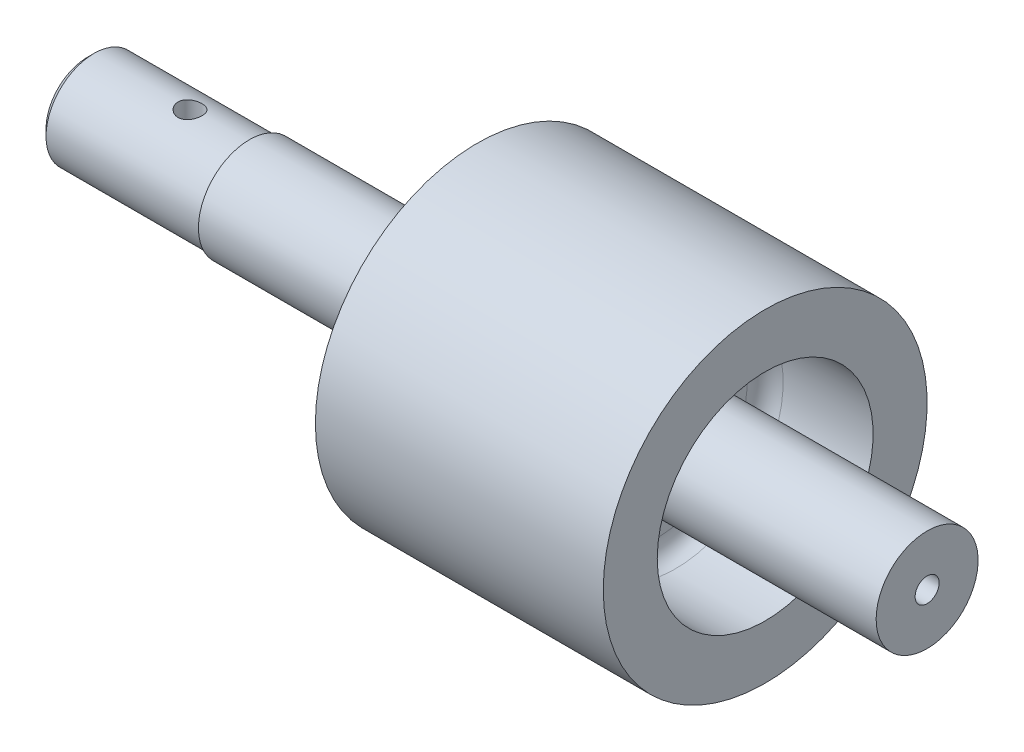
ISO-10303-21;
HEADER;
FILE_DESCRIPTION(('STEP AP214'),'2;1');
FILE_NAME('part.step','',(''),(''),'','','');
FILE_SCHEMA(('AUTOMOTIVE_DESIGN { 1 0 10303 214 1 1 1 1 }'));
ENDSEC;
DATA;
#1=APPLICATION_CONTEXT('core data for automotive mechanical design processes');
#2=APPLICATION_PROTOCOL_DEFINITION('international standard','automotive_design',2000,#1);
#3=PRODUCT_CONTEXT('',#1,'mechanical');
#4=PRODUCT('Part','Part','',(#3));
#5=PRODUCT_RELATED_PRODUCT_CATEGORY('part','',(#4));
#6=PRODUCT_DEFINITION_FORMATION('','',#4);
#7=PRODUCT_DEFINITION_CONTEXT('part definition',#1,'design');
#8=PRODUCT_DEFINITION('design','',#6,#7);
#9=PRODUCT_DEFINITION_SHAPE('','',#8);
#10=(LENGTH_UNIT() NAMED_UNIT(*) SI_UNIT(.MILLI.,.METRE.));
#11=(NAMED_UNIT(*) PLANE_ANGLE_UNIT() SI_UNIT($,.RADIAN.));
#12=(NAMED_UNIT(*) SI_UNIT($,.STERADIAN.) SOLID_ANGLE_UNIT());
#13=UNCERTAINTY_MEASURE_WITH_UNIT(LENGTH_MEASURE(1.E-05),#10,'distance_accuracy_value','');
#14=(GEOMETRIC_REPRESENTATION_CONTEXT(3) GLOBAL_UNCERTAINTY_ASSIGNED_CONTEXT((#13)) GLOBAL_UNIT_ASSIGNED_CONTEXT((#10,
#11,#12)) REPRESENTATION_CONTEXT('',''));
#15=CARTESIAN_POINT('',(0.,0.,0.));
#16=DIRECTION('',(0.,0.,1.));
#17=DIRECTION('',(1.,0.,0.));
#18=AXIS2_PLACEMENT_3D('',#15,#16,#17);
#19=CARTESIAN_POINT('',(0.,0.,0.));
#20=DIRECTION('',(-1.,0.,0.));
#21=DIRECTION('',(0.,0.,1.));
#22=AXIS2_PLACEMENT_3D('',#19,#20,#21);
#23=CYLINDRICAL_SURFACE('',#22,8.);
#24=CARTESIAN_POINT('',(17.1,7.74596669241484,1.99999999999999));
#25=CARTESIAN_POINT('',(16.9895593992587,7.74596880070288,1.99999686287445));
#26=CARTESIAN_POINT('',(16.8790840810572,7.74835444811678,1.99082099639812));
#27=CARTESIAN_POINT('',(16.6613059374612,7.75761489594051,1.95441850037103));
#28=CARTESIAN_POINT('',(16.5540049964255,7.76449230897304,1.92718136539368));
#29=CARTESIAN_POINT('',(16.3457571694503,7.7819097967692,1.85559295970563));
#30=CARTESIAN_POINT('',(16.2448022756914,7.79244514152366,1.81126378228359));
#31=CARTESIAN_POINT('',(16.0517513179681,7.81598553623007,1.7068169130091));
#32=CARTESIAN_POINT('',(15.9596556303358,7.82899069102791,1.64669855084854));
#33=CARTESIAN_POINT('',(15.7849106837902,7.856325730845,1.5109667418495));
#34=CARTESIAN_POINT('',(15.70248511972,7.87067678098427,1.43506951016324));
#35=CARTESIAN_POINT('',(15.5513908845117,7.89890300412235,1.27054565128053));
#36=CARTESIAN_POINT('',(15.4827234995026,7.91277813253111,1.18191783534424));
#37=CARTESIAN_POINT('',(15.360179625895,7.93872332416466,0.992916160863162));
#38=CARTESIAN_POINT('',(15.3065228894708,7.95076549920474,0.892395660956095));
#39=CARTESIAN_POINT('',(15.2169522846775,7.97144649540787,0.683410547434209));
#40=CARTESIAN_POINT('',(15.1810357984676,7.98008581867475,0.574947108633551));
#41=CARTESIAN_POINT('',(15.1286817323371,7.99283807078544,0.355487007003328));
#42=CARTESIAN_POINT('',(15.1118642845387,7.99703915075451,0.244586175639179));
#43=CARTESIAN_POINT('',(15.0969932965796,8.00074875285838,0.0214630554102149));
#44=CARTESIAN_POINT('',(15.0989369822323,8.00025796877363,-0.0907590356304551));
#45=CARTESIAN_POINT('',(15.1212598802001,7.99470475962828,-0.310704494344774));
#46=CARTESIAN_POINT('',(15.1412290600431,7.98974401872699,-0.418472431202134));
#47=CARTESIAN_POINT('',(15.1983770160388,7.97592669219883,-0.629076494827371));
#48=CARTESIAN_POINT('',(15.2355567083019,7.96706989918753,-0.731912358740874));
#49=CARTESIAN_POINT('',(15.3264020565497,7.94630007760717,-0.930813407003611));
#50=CARTESIAN_POINT('',(15.3802136357294,7.93436015756043,-1.02680901953301));
#51=CARTESIAN_POINT('',(15.502684543293,7.90871923047719,-1.20855124468097));
#52=CARTESIAN_POINT('',(15.5713464548485,7.89501791721992,-1.29429607017101));
#53=CARTESIAN_POINT('',(15.7237669935859,7.86690971015616,-1.45554807016991));
#54=CARTESIAN_POINT('',(15.8078839138782,7.85249375620734,-1.53071535815039));
#55=CARTESIAN_POINT('',(15.9876799788322,7.82492034813365,-1.66595275192603));
#56=CARTESIAN_POINT('',(16.0833596635928,7.81176295284777,-1.72602215209203));
#57=CARTESIAN_POINT('',(16.2842320273192,7.78816397465319,-1.82957625804519));
#58=CARTESIAN_POINT('',(16.3894685842506,7.77773586980577,-1.87297913394098));
#59=CARTESIAN_POINT('',(16.6060683744612,7.76094912111966,-1.94137124127268));
#60=CARTESIAN_POINT('',(16.7174302911865,7.75458960648175,-1.96636441310581));
#61=CARTESIAN_POINT('',(16.9399676012185,7.74684284831313,-1.99666371093214));
#62=CARTESIAN_POINT('',(17.0510702346637,7.74532871274919,-2.0024723791357));
#63=CARTESIAN_POINT('',(17.2726575492625,7.74709874784831,-1.99561359241243));
#64=CARTESIAN_POINT('',(17.383142286361,7.75038247681013,-1.98294783827903));
#65=CARTESIAN_POINT('',(17.5984914119638,7.76125665563649,-1.93994037115012));
#66=CARTESIAN_POINT('',(17.7034181812567,7.768775761875,-1.90989125462539));
#67=CARTESIAN_POINT('',(17.9067451662813,7.7872057461677,-1.83329446533649));
#68=CARTESIAN_POINT('',(18.0051446072443,7.79811702598891,-1.78674483817003));
#69=CARTESIAN_POINT('',(18.1947530222939,7.8223690967461,-1.67741653434924));
#70=CARTESIAN_POINT('',(18.2857830720345,7.83575334885313,-1.6143374030685));
#71=CARTESIAN_POINT('',(18.4561506902411,7.86333666457373,-1.47412058586891));
#72=CARTESIAN_POINT('',(18.5354863333201,7.87753586182776,-1.39698058961088));
#73=CARTESIAN_POINT('',(18.6822488340568,7.90557922425285,-1.22852544196945));
#74=CARTESIAN_POINT('',(18.749328050039,7.91940561649468,-1.13690390506318));
#75=CARTESIAN_POINT('',(18.867148693561,7.94477773290987,-0.943405365389346));
#76=CARTESIAN_POINT('',(18.9178909732866,7.95632357603169,-0.841528897915178));
#77=CARTESIAN_POINT('',(19.0011568276223,7.9757609259065,-0.631116403462179));
#78=CARTESIAN_POINT('',(19.0338114275032,7.98367864017925,-0.522634762055762));
#79=CARTESIAN_POINT('',(19.0803682676867,7.99508234716634,-0.301499520637613));
#80=CARTESIAN_POINT('',(19.0942741269912,7.99856919514738,-0.18884673008248));
#81=CARTESIAN_POINT('',(19.1027351791511,8.00068338817612,0.0341670528866463));
#82=CARTESIAN_POINT('',(19.0978034181908,7.99943957759977,0.144507653932043));
#83=CARTESIAN_POINT('',(19.0699043454113,7.99251792914887,0.3627349928295));
#84=CARTESIAN_POINT('',(19.0469375699737,7.98684022314338,0.470621803561855));
#85=CARTESIAN_POINT('',(18.9838955604583,7.97170865707778,0.680342071289546));
#86=CARTESIAN_POINT('',(18.9439130933712,7.96227529004785,0.782204989161723));
#87=CARTESIAN_POINT('',(18.8480588419609,7.94062577827316,0.977834106083245));
#88=CARTESIAN_POINT('',(18.792185054659,7.92840928277515,1.07159928253126));
#89=CARTESIAN_POINT('',(18.6645695320077,7.90214499360574,1.2508038568466));
#90=CARTESIAN_POINT('',(18.5924797141923,7.88806033883329,1.33598997659667));
#91=CARTESIAN_POINT('',(18.4351542960453,7.85981298114379,1.493230040547));
#92=CARTESIAN_POINT('',(18.3499153677777,7.84565025934604,1.56528065015318));
#93=CARTESIAN_POINT('',(18.1667971716211,7.81854951691005,1.69552405294366));
#94=CARTESIAN_POINT('',(18.0687117532695,7.80563927346578,1.75343323883275));
#95=CARTESIAN_POINT('',(17.8638890202504,7.78287910989656,1.85185379317094));
#96=CARTESIAN_POINT('',(17.7571580678123,7.77302696466428,1.8923778195043));
#97=CARTESIAN_POINT('',(17.5588459763297,7.75903817501475,1.948845057142));
#98=CARTESIAN_POINT('',(17.4682136712277,7.75417326006998,1.96798634119375));
#99=CARTESIAN_POINT('',(17.2850622620046,7.7476367716524,1.99356458514353));
#100=CARTESIAN_POINT('',(17.1925433195112,7.74596492578216,2.0000026287435));
#101=CARTESIAN_POINT('',(17.1,7.74596669241484,1.99999999999999));
#102=B_SPLINE_CURVE_WITH_KNOTS('',3,(#24,#25,#26,#27,#28,#29,#30,#31,#32,#33,#34,#35,#36,#37,
#38,#39,#40,#41,#42,#43,#44,#45,#46,#47,#48,#49,#50,#51,#52,#53,#54,#55,#56,#57,#58,#59,#60,#61,
#62,#63,#64,#65,#66,#67,#68,#69,#70,#71,#72,#73,#74,#75,#76,#77,#78,#79,#80,#81,#82,#83,#84,#85,
#86,#87,#88,#89,#90,#91,#92,#93,#94,#95,#96,#97,#98,#99,#100,#101),.UNSPECIFIED.,.T.,.F.,(4,2,2,
2,2,2,2,2,2,2,2,2,2,2,2,2,2,2,2,2,2,2,2,2,2,2,2,2,2,2,2,2,2,2,2,2,2,2,4),(0.,0.330981953388906,
0.662156593142931,0.992904581732818,1.32366661404382,1.6609916335438,1.99834817183893,
2.34041197118335,2.68242527877673,3.01751000796276,3.35254518932816,3.68014610151157,
4.00776445379828,4.33834299403554,4.66897908375129,5.00856373257528,5.3481642495984,
5.6894114560672,6.03058560103636,6.36274859809371,6.69488101747039,7.02157924007363,
7.34831617137132,7.68146276687323,8.01466415108034,8.35620264772253,8.6977233257564,
9.03673658245541,9.37568439127228,9.70546756901962,10.0352409390158,10.3632390124777,
10.6912784459045,11.0271767726565,11.363160252524,11.7054118182895,12.0474137709605,
12.3247826174462,12.6021278008237),.UNSPECIFIED.);
#103=CARTESIAN_POINT('',(17.1,7.74596669241484,1.99999999999999));
#104=VERTEX_POINT('',#103);
#105=EDGE_CURVE('E11',#104,#104,#102,.T.);
#106=ORIENTED_EDGE('',*,*,#105,.T.);
#107=EDGE_LOOP('',(#106));
#108=FACE_BOUND('',#107,.T.);
#109=CARTESIAN_POINT('',(1.08249999999999,0.,0.));
#110=DIRECTION('',(1.,0.,0.));
#111=DIRECTION('',(0.,0.,-1.));
#112=AXIS2_PLACEMENT_3D('',#109,#110,#111);
#113=CIRCLE('',#112,8.);
#114=CARTESIAN_POINT('',(1.08249999999999,0.,-8.));
#115=VERTEX_POINT('',#114);
#116=EDGE_CURVE('E87',#115,#115,#113,.T.);
#117=ORIENTED_EDGE('',*,*,#116,.T.);
#118=EDGE_LOOP('',(#117));
#119=FACE_BOUND('',#118,.T.);
#120=CARTESIAN_POINT('',(27.,0.,0.));
#121=DIRECTION('',(-1.,0.,0.));
#122=DIRECTION('',(0.,0.,1.));
#123=AXIS2_PLACEMENT_3D('',#120,#121,#122);
#124=CIRCLE('',#123,8.);
#125=CARTESIAN_POINT('',(27.,0.,8.));
#126=VERTEX_POINT('',#125);
#127=EDGE_CURVE('E108',#126,#126,#124,.T.);
#128=ORIENTED_EDGE('',*,*,#127,.T.);
#129=EDGE_LOOP('',(#128));
#130=FACE_BOUND('',#129,.T.);
#131=ADVANCED_FACE('F47',(#108,#119,#130),#23,.T.);
#132=CARTESIAN_POINT('',(27.,8.,0.));
#133=DIRECTION('',(1.,0.,0.));
#134=DIRECTION('',(0.,0.,-1.));
#135=AXIS2_PLACEMENT_3D('',#132,#133,#134);
#136=PLANE('',#135);
#137=ORIENTED_EDGE('',*,*,#127,.F.);
#138=EDGE_LOOP('',(#137));
#139=FACE_BOUND('',#138,.T.);
#140=CARTESIAN_POINT('',(27.,0.,0.));
#141=DIRECTION('',(-1.,0.,0.));
#142=DIRECTION('',(0.,0.,1.));
#143=AXIS2_PLACEMENT_3D('',#140,#141,#142);
#144=CIRCLE('',#143,8.5);
#145=CARTESIAN_POINT('',(27.,0.,8.5));
#146=VERTEX_POINT('',#145);
#147=EDGE_CURVE('E105',#146,#146,#144,.T.);
#148=ORIENTED_EDGE('',*,*,#147,.T.);
#149=EDGE_LOOP('',(#148));
#150=FACE_BOUND('',#149,.T.);
#151=ADVANCED_FACE('F153',(#139,#150),#136,.F.);
#152=CARTESIAN_POINT('',(0.,0.,0.));
#153=DIRECTION('',(-1.,0.,0.));
#154=DIRECTION('',(0.,0.,1.));
#155=AXIS2_PLACEMENT_3D('',#152,#153,#154);
#156=CYLINDRICAL_SURFACE('',#155,8.5);
#157=CARTESIAN_POINT('',(80.,0.,0.));
#158=DIRECTION('',(1.,0.,0.));
#159=DIRECTION('',(0.,0.,-1.));
#160=AXIS2_PLACEMENT_3D('',#157,#158,#159);
#161=CIRCLE('',#160,8.5);
#162=CARTESIAN_POINT('',(80.,0.,-8.5));
#163=VERTEX_POINT('',#162);
#164=EDGE_CURVE('E60',#163,#163,#161,.F.);
#165=ORIENTED_EDGE('',*,*,#164,.T.);
#166=EDGE_LOOP('',(#165));
#167=FACE_BOUND('',#166,.T.);
#168=ORIENTED_EDGE('',*,*,#147,.F.);
#169=EDGE_LOOP('',(#168));
#170=FACE_BOUND('',#169,.T.);
#171=ADVANCED_FACE('F134',(#167,#170),#156,.T.);
#172=CARTESIAN_POINT('',(83.,8.5,0.));
#173=DIRECTION('',(1.,0.,0.));
#174=DIRECTION('',(0.,0.,-1.));
#175=AXIS2_PLACEMENT_3D('',#172,#173,#174);
#176=PLANE('',#175);
#177=CARTESIAN_POINT('',(83.,0.,0.));
#178=DIRECTION('',(1.,0.,0.));
#179=DIRECTION('',(0.,0.,-1.));
#180=AXIS2_PLACEMENT_3D('',#177,#178,#179);
#181=CIRCLE('',#180,15.);
#182=CARTESIAN_POINT('',(83.,0.,-15.));
#183=VERTEX_POINT('',#182);
#184=EDGE_CURVE('E126',#183,#183,#181,.F.);
#185=ORIENTED_EDGE('',*,*,#184,.T.);
#186=EDGE_LOOP('',(#185));
#187=FACE_BOUND('',#186,.T.);
#188=CARTESIAN_POINT('',(83.,0.,0.));
#189=DIRECTION('',(1.,0.,0.));
#190=DIRECTION('',(0.,0.,-1.));
#191=AXIS2_PLACEMENT_3D('',#188,#189,#190);
#192=CIRCLE('',#191,11.5);
#193=CARTESIAN_POINT('',(83.,0.,-11.5));
#194=VERTEX_POINT('',#193);
#195=EDGE_CURVE('E123',#194,#194,#192,.T.);
#196=ORIENTED_EDGE('',*,*,#195,.T.);
#197=EDGE_LOOP('',(#196));
#198=FACE_BOUND('',#197,.T.);
#199=ADVANCED_FACE('F209',(#187,#198),#176,.F.);
#200=CARTESIAN_POINT('',(0.,0.,0.));
#201=DIRECTION('',(-1.,0.,0.));
#202=DIRECTION('',(0.,0.,1.));
#203=AXIS2_PLACEMENT_3D('',#200,#201,#202);
#204=CYLINDRICAL_SURFACE('',#203,18.);
#205=CARTESIAN_POINT('',(80.,0.,0.));
#206=DIRECTION('',(1.,0.,0.));
#207=DIRECTION('',(0.,0.,-1.));
#208=AXIS2_PLACEMENT_3D('',#205,#206,#207);
#209=CIRCLE('',#208,18.);
#210=CARTESIAN_POINT('',(80.,0.,-18.));
#211=VERTEX_POINT('',#210);
#212=EDGE_CURVE('E129',#211,#211,#209,.T.);
#213=ORIENTED_EDGE('',*,*,#212,.T.);
#214=EDGE_LOOP('',(#213));
#215=FACE_BOUND('',#214,.T.);
#216=CARTESIAN_POINT('',(65.,0.,0.));
#217=DIRECTION('',(-1.,0.,0.));
#218=DIRECTION('',(0.,0.,1.));
#219=AXIS2_PLACEMENT_3D('',#216,#217,#218);
#220=CIRCLE('',#219,18.);
#221=CARTESIAN_POINT('',(65.,0.,18.));
#222=VERTEX_POINT('',#221);
#223=EDGE_CURVE('E102',#222,#222,#220,.T.);
#224=ORIENTED_EDGE('',*,*,#223,.T.);
#225=EDGE_LOOP('',(#224));
#226=FACE_BOUND('',#225,.T.);
#227=ADVANCED_FACE('F205',(#215,#226),#204,.F.);
#228=CARTESIAN_POINT('',(65.,18.,0.));
#229=DIRECTION('',(1.,0.,0.));
#230=DIRECTION('',(0.,0.,-1.));
#231=AXIS2_PLACEMENT_3D('',#228,#229,#230);
#232=PLANE('',#231);
#233=ORIENTED_EDGE('',*,*,#223,.F.);
#234=EDGE_LOOP('',(#233));
#235=FACE_BOUND('',#234,.T.);
#236=CARTESIAN_POINT('',(65.,0.,0.));
#237=DIRECTION('',(-1.,0.,0.));
#238=DIRECTION('',(0.,0.,1.));
#239=AXIS2_PLACEMENT_3D('',#236,#237,#238);
#240=CIRCLE('',#239,27.);
#241=CARTESIAN_POINT('',(65.,0.,27.));
#242=VERTEX_POINT('',#241);
#243=EDGE_CURVE('E99',#242,#242,#240,.T.);
#244=ORIENTED_EDGE('',*,*,#243,.T.);
#245=EDGE_LOOP('',(#244));
#246=FACE_BOUND('',#245,.T.);
#247=ADVANCED_FACE('F197',(#235,#246),#232,.F.);
#248=CARTESIAN_POINT('',(0.,0.,0.));
#249=DIRECTION('',(-1.,0.,0.));
#250=DIRECTION('',(0.,0.,1.));
#251=AXIS2_PLACEMENT_3D('',#248,#249,#250);
#252=CYLINDRICAL_SURFACE('',#251,27.);
#253=ORIENTED_EDGE('',*,*,#243,.F.);
#254=EDGE_LOOP('',(#253));
#255=FACE_BOUND('',#254,.T.);
#256=CARTESIAN_POINT('',(113.,0.,0.));
#257=DIRECTION('',(-1.,0.,0.));
#258=DIRECTION('',(0.,0.,1.));
#259=AXIS2_PLACEMENT_3D('',#256,#257,#258);
#260=CIRCLE('',#259,27.);
#261=CARTESIAN_POINT('',(113.,0.,27.));
#262=VERTEX_POINT('',#261);
#263=EDGE_CURVE('E96',#262,#262,#260,.T.);
#264=ORIENTED_EDGE('',*,*,#263,.T.);
#265=EDGE_LOOP('',(#264));
#266=FACE_BOUND('',#265,.T.);
#267=ADVANCED_FACE('F190',(#255,#266),#252,.T.);
#268=CARTESIAN_POINT('',(113.,27.,0.));
#269=DIRECTION('',(-1.,0.,0.));
#270=DIRECTION('',(0.,0.,1.));
#271=AXIS2_PLACEMENT_3D('',#268,#269,#270);
#272=PLANE('',#271);
#273=ORIENTED_EDGE('',*,*,#263,.F.);
#274=EDGE_LOOP('',(#273));
#275=FACE_BOUND('',#274,.T.);
#276=CARTESIAN_POINT('',(113.,0.,0.));
#277=DIRECTION('',(-1.,0.,0.));
#278=DIRECTION('',(0.,0.,1.));
#279=AXIS2_PLACEMENT_3D('',#276,#277,#278);
#280=CIRCLE('',#279,18.);
#281=CARTESIAN_POINT('',(113.,0.,18.));
#282=VERTEX_POINT('',#281);
#283=EDGE_CURVE('E93',#282,#282,#280,.T.);
#284=ORIENTED_EDGE('',*,*,#283,.T.);
#285=EDGE_LOOP('',(#284));
#286=FACE_BOUND('',#285,.T.);
#287=ADVANCED_FACE('F185',(#275,#286),#272,.F.);
#288=CARTESIAN_POINT('',(0.,0.,0.));
#289=DIRECTION('',(-1.,0.,0.));
#290=DIRECTION('',(0.,0.,1.));
#291=AXIS2_PLACEMENT_3D('',#288,#289,#290);
#292=CYLINDRICAL_SURFACE('',#291,18.);
#293=CARTESIAN_POINT('',(98.,0.,0.));
#294=DIRECTION('',(-1.,0.,0.));
#295=DIRECTION('',(0.,0.,1.));
#296=AXIS2_PLACEMENT_3D('',#293,#294,#295);
#297=CIRCLE('',#296,18.);
#298=CARTESIAN_POINT('',(98.,0.,18.));
#299=VERTEX_POINT('',#298);
#300=EDGE_CURVE('E120',#299,#299,#297,.T.);
#301=ORIENTED_EDGE('',*,*,#300,.T.);
#302=EDGE_LOOP('',(#301));
#303=FACE_BOUND('',#302,.T.);
#304=ORIENTED_EDGE('',*,*,#283,.F.);
#305=EDGE_LOOP('',(#304));
#306=FACE_BOUND('',#305,.T.);
#307=ADVANCED_FACE('F181',(#303,#306),#292,.F.);
#308=CARTESIAN_POINT('',(95.,18.,0.));
#309=DIRECTION('',(-1.,0.,0.));
#310=DIRECTION('',(0.,0.,1.));
#311=AXIS2_PLACEMENT_3D('',#308,#309,#310);
#312=PLANE('',#311);
#313=CARTESIAN_POINT('',(95.,0.,0.));
#314=DIRECTION('',(-1.,0.,0.));
#315=DIRECTION('',(0.,0.,1.));
#316=AXIS2_PLACEMENT_3D('',#313,#314,#315);
#317=CIRCLE('',#316,11.5);
#318=CARTESIAN_POINT('',(95.,0.,11.5));
#319=VERTEX_POINT('',#318);
#320=EDGE_CURVE('E114',#319,#319,#317,.T.);
#321=ORIENTED_EDGE('',*,*,#320,.T.);
#322=EDGE_LOOP('',(#321));
#323=FACE_BOUND('',#322,.T.);
#324=CARTESIAN_POINT('',(95.,0.,0.));
#325=DIRECTION('',(-1.,0.,0.));
#326=DIRECTION('',(0.,0.,1.));
#327=AXIS2_PLACEMENT_3D('',#324,#325,#326);
#328=CIRCLE('',#327,15.);
#329=CARTESIAN_POINT('',(95.,0.,15.));
#330=VERTEX_POINT('',#329);
#331=EDGE_CURVE('E111',#330,#330,#328,.F.);
#332=ORIENTED_EDGE('',*,*,#331,.T.);
#333=EDGE_LOOP('',(#332));
#334=FACE_BOUND('',#333,.T.);
#335=ADVANCED_FACE('F184',(#323,#334),#312,.F.);
#336=CARTESIAN_POINT('',(0.,0.,0.));
#337=DIRECTION('',(-1.,0.,0.));
#338=DIRECTION('',(0.,0.,1.));
#339=AXIS2_PLACEMENT_3D('',#336,#337,#338);
#340=CYLINDRICAL_SURFACE('',#339,8.5);
#341=CARTESIAN_POINT('',(98.,0.,0.));
#342=DIRECTION('',(-1.,0.,0.));
#343=DIRECTION('',(0.,0.,1.));
#344=AXIS2_PLACEMENT_3D('',#341,#342,#343);
#345=CIRCLE('',#344,8.5);
#346=CARTESIAN_POINT('',(98.,0.,8.5));
#347=VERTEX_POINT('',#346);
#348=EDGE_CURVE('E117',#347,#347,#345,.F.);
#349=ORIENTED_EDGE('',*,*,#348,.T.);
#350=EDGE_LOOP('',(#349));
#351=FACE_BOUND('',#350,.T.);
#352=CARTESIAN_POINT('',(140.,0.,0.));
#353=DIRECTION('',(-1.,0.,0.));
#354=DIRECTION('',(0.,0.,1.));
#355=AXIS2_PLACEMENT_3D('',#352,#353,#354);
#356=CIRCLE('',#355,8.5);
#357=CARTESIAN_POINT('',(140.,0.,8.5));
#358=VERTEX_POINT('',#357);
#359=EDGE_CURVE('E90',#358,#358,#356,.T.);
#360=ORIENTED_EDGE('',*,*,#359,.T.);
#361=EDGE_LOOP('',(#360));
#362=FACE_BOUND('',#361,.T.);
#363=ADVANCED_FACE('F239',(#351,#362),#340,.T.);
#364=CARTESIAN_POINT('',(140.,8.5,0.));
#365=DIRECTION('',(-1.,0.,0.));
#366=DIRECTION('',(0.,0.,1.));
#367=AXIS2_PLACEMENT_3D('',#364,#365,#366);
#368=PLANE('',#367);
#369=CARTESIAN_POINT('',(140.,0.,0.));
#370=DIRECTION('',(1.,0.,0.));
#371=DIRECTION('',(0.,0.,-1.));
#372=AXIS2_PLACEMENT_3D('',#369,#370,#371);
#373=CIRCLE('',#372,1.99999999999999);
#374=CARTESIAN_POINT('',(140.,0.,-1.99999999999999));
#375=VERTEX_POINT('',#374);
#376=EDGE_CURVE('E77',#375,#375,#373,.T.);
#377=ORIENTED_EDGE('',*,*,#376,.F.);
#378=EDGE_LOOP('',(#377));
#379=FACE_BOUND('',#378,.T.);
#380=ORIENTED_EDGE('',*,*,#359,.F.);
#381=EDGE_LOOP('',(#380));
#382=FACE_BOUND('',#381,.T.);
#383=ADVANCED_FACE('F171',(#379,#382),#368,.F.);
#384=CARTESIAN_POINT('',(98.,0.,0.));
#385=DIRECTION('',(-1.,0.,0.));
#386=DIRECTION('',(0.,0.,1.));
#387=AXIS2_PLACEMENT_3D('',#384,#385,#386);
#388=TOROIDAL_SURFACE('',#387,11.5,3.);
#389=ORIENTED_EDGE('',*,*,#348,.F.);
#390=EDGE_LOOP('',(#389));
#391=FACE_BOUND('',#390,.T.);
#392=ORIENTED_EDGE('',*,*,#320,.F.);
#393=EDGE_LOOP('',(#392));
#394=FACE_BOUND('',#393,.T.);
#395=ADVANCED_FACE('F168',(#391,#394),#388,.F.);
#396=CARTESIAN_POINT('',(98.,0.,0.));
#397=DIRECTION('',(-1.,0.,0.));
#398=DIRECTION('',(0.,0.,1.));
#399=AXIS2_PLACEMENT_3D('',#396,#397,#398);
#400=TOROIDAL_SURFACE('',#399,15.,3.);
#401=ORIENTED_EDGE('',*,*,#331,.F.);
#402=EDGE_LOOP('',(#401));
#403=FACE_BOUND('',#402,.T.);
#404=ORIENTED_EDGE('',*,*,#300,.F.);
#405=EDGE_LOOP('',(#404));
#406=FACE_BOUND('',#405,.T.);
#407=ADVANCED_FACE('F149',(#403,#406),#400,.F.);
#408=CARTESIAN_POINT('',(80.,0.,0.));
#409=DIRECTION('',(1.,0.,0.));
#410=DIRECTION('',(0.,0.,-1.));
#411=AXIS2_PLACEMENT_3D('',#408,#409,#410);
#412=TOROIDAL_SURFACE('',#411,15.,3.);
#413=ORIENTED_EDGE('',*,*,#212,.F.);
#414=EDGE_LOOP('',(#413));
#415=FACE_BOUND('',#414,.T.);
#416=ORIENTED_EDGE('',*,*,#184,.F.);
#417=EDGE_LOOP('',(#416));
#418=FACE_BOUND('',#417,.T.);
#419=ADVANCED_FACE('F139',(#415,#418),#412,.F.);
#420=CARTESIAN_POINT('',(80.,0.,0.));
#421=DIRECTION('',(1.,0.,0.));
#422=DIRECTION('',(0.,0.,-1.));
#423=AXIS2_PLACEMENT_3D('',#420,#421,#422);
#424=TOROIDAL_SURFACE('',#423,11.5,3.);
#425=ORIENTED_EDGE('',*,*,#195,.F.);
#426=EDGE_LOOP('',(#425));
#427=FACE_BOUND('',#426,.T.);
#428=ORIENTED_EDGE('',*,*,#164,.F.);
#429=EDGE_LOOP('',(#428));
#430=FACE_BOUND('',#429,.T.);
#431=ADVANCED_FACE('F49',(#427,#430),#424,.F.);
#432=CARTESIAN_POINT('',(0.,0.,0.));
#433=DIRECTION('',(1.,0.,0.));
#434=DIRECTION('',(0.,0.,-1.));
#435=AXIS2_PLACEMENT_3D('',#432,#433,#434);
#436=CONICAL_SURFACE('',#435,6.9175,0.785398163397454);
#437=ORIENTED_EDGE('',*,*,#116,.F.);
#438=EDGE_LOOP('',(#437));
#439=FACE_BOUND('',#438,.T.);
#440=CARTESIAN_POINT('',(0.,0.,0.));
#441=DIRECTION('',(1.,0.,0.));
#442=DIRECTION('',(0.,0.,-1.));
#443=AXIS2_PLACEMENT_3D('',#440,#441,#442);
#444=CIRCLE('',#443,6.9175);
#445=CARTESIAN_POINT('',(0.,0.,-6.9175));
#446=VERTEX_POINT('',#445);
#447=EDGE_CURVE('E80',#446,#446,#444,.T.);
#448=ORIENTED_EDGE('',*,*,#447,.T.);
#449=EDGE_LOOP('',(#448));
#450=FACE_BOUND('',#449,.T.);
#451=ADVANCED_FACE('F138',(#439,#450),#436,.T.);
#452=CARTESIAN_POINT('',(0.,0.,0.));
#453=DIRECTION('',(1.,0.,0.));
#454=DIRECTION('',(0.,0.,-1.));
#455=AXIS2_PLACEMENT_3D('',#452,#453,#454);
#456=PLANE('',#455);
#457=ORIENTED_EDGE('',*,*,#447,.F.);
#458=EDGE_LOOP('',(#457));
#459=FACE_BOUND('',#458,.T.);
#460=ADVANCED_FACE('F146',(#459),#456,.F.);
#461=CARTESIAN_POINT('',(17.1,8.,0.));
#462=DIRECTION('',(0.,1.,0.));
#463=DIRECTION('',(0.,0.,1.));
#464=AXIS2_PLACEMENT_3D('',#461,#462,#463);
#465=CYLINDRICAL_SURFACE('',#464,1.99999999999999);
#466=CARTESIAN_POINT('',(17.1,0.,0.));
#467=DIRECTION('',(0.,1.,0.));
#468=DIRECTION('',(0.,0.,1.));
#469=AXIS2_PLACEMENT_3D('',#466,#467,#468);
#470=CIRCLE('',#469,2.);
#471=CARTESIAN_POINT('',(17.1,0.,2.));
#472=VERTEX_POINT('',#471);
#473=EDGE_CURVE('E76',#472,#472,#470,.T.);
#474=ORIENTED_EDGE('',*,*,#473,.F.);
#475=EDGE_LOOP('',(#474));
#476=FACE_BOUND('',#475,.T.);
#477=ORIENTED_EDGE('',*,*,#105,.F.);
#478=EDGE_LOOP('',(#477));
#479=FACE_BOUND('',#478,.T.);
#480=ADVANCED_FACE('F166',(#476,#479),#465,.F.);
#481=CARTESIAN_POINT('',(17.1,0.,0.));
#482=DIRECTION('',(0.,1.,0.));
#483=DIRECTION('',(0.,0.,1.));
#484=AXIS2_PLACEMENT_3D('',#481,#482,#483);
#485=CONICAL_SURFACE('',#484,2.,1.02974425867665);
#486=CARTESIAN_POINT('',(17.1,-1.20172123805512,0.));
#487=VERTEX_POINT('',#486);
#488=VERTEX_LOOP('',#487);
#489=FACE_BOUND('',#488,.T.);
#490=ORIENTED_EDGE('',*,*,#473,.T.);
#491=EDGE_LOOP('',(#490));
#492=FACE_BOUND('',#491,.T.);
#493=ADVANCED_FACE('F70',(#489,#492),#485,.F.);
#494=CARTESIAN_POINT('',(133.,0.,0.));
#495=DIRECTION('',(1.,0.,0.));
#496=DIRECTION('',(0.,0.,-1.));
#497=AXIS2_PLACEMENT_3D('',#494,#495,#496);
#498=CONICAL_SURFACE('',#497,2.,1.02974425867665);
#499=CARTESIAN_POINT('',(131.798278761945,0.,0.));
#500=VERTEX_POINT('',#499);
#501=VERTEX_LOOP('',#500);
#502=FACE_BOUND('',#501,.T.);
#503=CARTESIAN_POINT('',(133.,0.,0.));
#504=DIRECTION('',(1.,0.,0.));
#505=DIRECTION('',(0.,0.,-1.));
#506=AXIS2_PLACEMENT_3D('',#503,#504,#505);
#507=CIRCLE('',#506,2.);
#508=CARTESIAN_POINT('',(133.,0.,-2.));
#509=VERTEX_POINT('',#508);
#510=EDGE_CURVE('E74',#509,#509,#507,.T.);
#511=ORIENTED_EDGE('',*,*,#510,.T.);
#512=EDGE_LOOP('',(#511));
#513=FACE_BOUND('',#512,.T.);
#514=ADVANCED_FACE('F66',(#502,#513),#498,.F.);
#515=CARTESIAN_POINT('',(140.,0.,0.));
#516=DIRECTION('',(1.,0.,0.));
#517=DIRECTION('',(0.,0.,-1.));
#518=AXIS2_PLACEMENT_3D('',#515,#516,#517);
#519=CYLINDRICAL_SURFACE('',#518,1.99999999999999);
#520=ORIENTED_EDGE('',*,*,#510,.F.);
#521=EDGE_LOOP('',(#520));
#522=FACE_BOUND('',#521,.T.);
#523=ORIENTED_EDGE('',*,*,#376,.T.);
#524=EDGE_LOOP('',(#523));
#525=FACE_BOUND('',#524,.T.);
#526=ADVANCED_FACE('F69',(#522,#525),#519,.F.);
#527=CLOSED_SHELL('',(#131,#151,#171,#199,#227,#247,#267,#287,#307,#335,#363,#383,#395,#407,
#419,#431,#451,#460,#480,#493,#514,#526));
#528=MANIFOLD_SOLID_BREP('B2',#527);
#529=ADVANCED_BREP_SHAPE_REPRESENTATION('',(#18,#528),#14);
#530=SHAPE_DEFINITION_REPRESENTATION(#9,#529);
ENDSEC;
END-ISO-10303-21;
